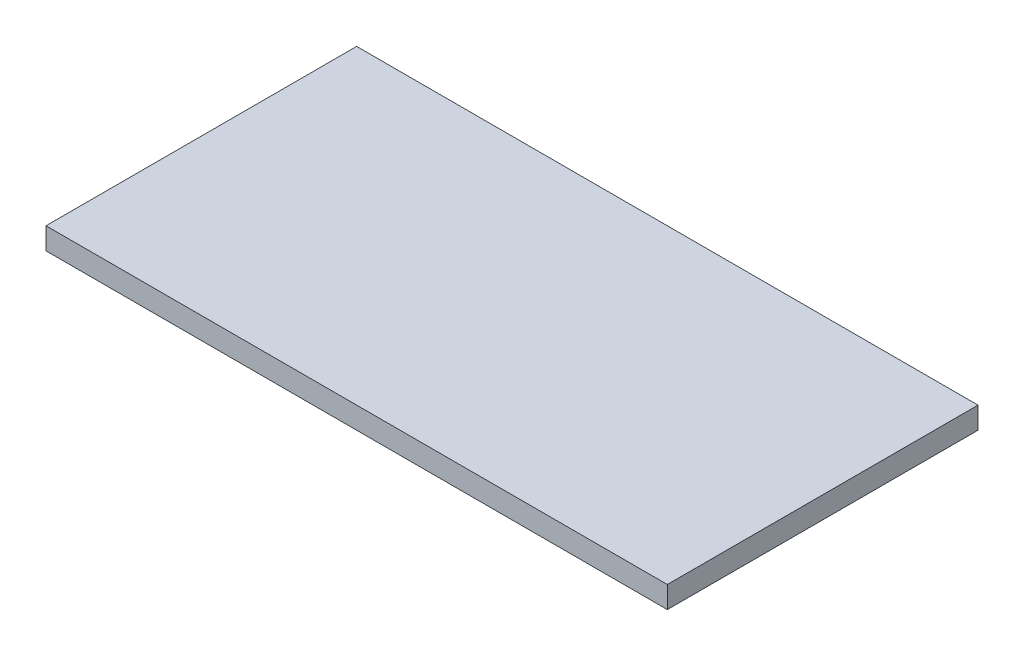
ISO-10303-21;
HEADER;
FILE_DESCRIPTION(('STEP AP214'),'2;1');
FILE_NAME('part.step','',(''),(''),'','','');
FILE_SCHEMA(('AUTOMOTIVE_DESIGN { 1 0 10303 214 1 1 1 1 }'));
ENDSEC;
DATA;
#1=APPLICATION_CONTEXT('core data for automotive mechanical design processes');
#2=APPLICATION_PROTOCOL_DEFINITION('international standard','automotive_design',2000,#1);
#3=PRODUCT_CONTEXT('',#1,'mechanical');
#4=PRODUCT('Part','Part','',(#3));
#5=PRODUCT_RELATED_PRODUCT_CATEGORY('part','',(#4));
#6=PRODUCT_DEFINITION_FORMATION('','',#4);
#7=PRODUCT_DEFINITION_CONTEXT('part definition',#1,'design');
#8=PRODUCT_DEFINITION('design','',#6,#7);
#9=PRODUCT_DEFINITION_SHAPE('','',#8);
#10=(LENGTH_UNIT() NAMED_UNIT(*) SI_UNIT(.MILLI.,.METRE.));
#11=(NAMED_UNIT(*) PLANE_ANGLE_UNIT() SI_UNIT($,.RADIAN.));
#12=(NAMED_UNIT(*) SI_UNIT($,.STERADIAN.) SOLID_ANGLE_UNIT());
#13=UNCERTAINTY_MEASURE_WITH_UNIT(LENGTH_MEASURE(1.E-05),#10,'distance_accuracy_value','');
#14=(GEOMETRIC_REPRESENTATION_CONTEXT(3) GLOBAL_UNCERTAINTY_ASSIGNED_CONTEXT((#13)) GLOBAL_UNIT_ASSIGNED_CONTEXT((#10,
#11,#12)) REPRESENTATION_CONTEXT('',''));
#15=CARTESIAN_POINT('',(0.,0.,0.));
#16=DIRECTION('',(0.,0.,1.));
#17=DIRECTION('',(1.,0.,0.));
#18=AXIS2_PLACEMENT_3D('',#15,#16,#17);
#19=CARTESIAN_POINT('',(10.,0.7,5.));
#20=DIRECTION('',(-1.,0.,0.));
#21=DIRECTION('',(0.,0.,1.));
#22=AXIS2_PLACEMENT_3D('',#19,#20,#21);
#23=PLANE('',#22);
#24=DIRECTION('',(0.,0.,-1.));
#25=VECTOR('',#24,1.);
#26=CARTESIAN_POINT('',(10.,0.,5.));
#27=LINE('',#26,#25);
#28=CARTESIAN_POINT('',(10.,0.,5.));
#29=VERTEX_POINT('',#28);
#30=CARTESIAN_POINT('',(10.,0.,-5.));
#31=VERTEX_POINT('',#30);
#32=EDGE_CURVE('E96',#29,#31,#27,.T.);
#33=ORIENTED_EDGE('',*,*,#32,.T.);
#34=DIRECTION('',(0.,-1.,0.));
#35=VECTOR('',#34,1.);
#36=CARTESIAN_POINT('',(10.,0.7,-5.));
#37=LINE('',#36,#35);
#38=CARTESIAN_POINT('',(10.,0.7,-5.));
#39=VERTEX_POINT('',#38);
#40=EDGE_CURVE('E11',#39,#31,#37,.T.);
#41=ORIENTED_EDGE('',*,*,#40,.F.);
#42=DIRECTION('',(0.,0.,-1.));
#43=VECTOR('',#42,1.);
#44=CARTESIAN_POINT('',(10.,0.7,5.));
#45=LINE('',#44,#43);
#46=CARTESIAN_POINT('',(10.,0.7,5.));
#47=VERTEX_POINT('',#46);
#48=EDGE_CURVE('E84',#47,#39,#45,.T.);
#49=ORIENTED_EDGE('',*,*,#48,.F.);
#50=DIRECTION('',(0.,-1.,0.));
#51=VECTOR('',#50,1.);
#52=CARTESIAN_POINT('',(10.,0.7,5.));
#53=LINE('',#52,#51);
#54=EDGE_CURVE('E92',#47,#29,#53,.T.);
#55=ORIENTED_EDGE('',*,*,#54,.T.);
#56=EDGE_LOOP('',(#33,#41,#49,#55));
#57=FACE_BOUND('',#56,.T.);
#58=ADVANCED_FACE('F33',(#57),#23,.F.);
#59=CARTESIAN_POINT('',(-10.,0.7,-5.));
#60=DIRECTION('',(0.,0.,1.));
#61=DIRECTION('',(1.,0.,0.));
#62=AXIS2_PLACEMENT_3D('',#59,#60,#61);
#63=PLANE('',#62);
#64=DIRECTION('',(-1.,0.,0.));
#65=VECTOR('',#64,1.);
#66=CARTESIAN_POINT('',(-10.,0.,-5.));
#67=LINE('',#66,#65);
#68=CARTESIAN_POINT('',(-10.,0.,-5.));
#69=VERTEX_POINT('',#68);
#70=EDGE_CURVE('E88',#31,#69,#67,.T.);
#71=ORIENTED_EDGE('',*,*,#70,.T.);
#72=DIRECTION('',(0.,-1.,0.));
#73=VECTOR('',#72,1.);
#74=CARTESIAN_POINT('',(-10.,0.7,-5.));
#75=LINE('',#74,#73);
#76=CARTESIAN_POINT('',(-10.,0.7,-5.));
#77=VERTEX_POINT('',#76);
#78=EDGE_CURVE('E41',#77,#69,#75,.T.);
#79=ORIENTED_EDGE('',*,*,#78,.F.);
#80=DIRECTION('',(-1.,0.,0.));
#81=VECTOR('',#80,1.);
#82=CARTESIAN_POINT('',(-10.,0.7,-5.));
#83=LINE('',#82,#81);
#84=EDGE_CURVE('E79',#39,#77,#83,.T.);
#85=ORIENTED_EDGE('',*,*,#84,.F.);
#86=ORIENTED_EDGE('',*,*,#40,.T.);
#87=EDGE_LOOP('',(#71,#79,#85,#86));
#88=FACE_BOUND('',#87,.T.);
#89=ADVANCED_FACE('F87',(#88),#63,.F.);
#90=CARTESIAN_POINT('',(-10.,0.7,5.));
#91=DIRECTION('',(1.,0.,0.));
#92=DIRECTION('',(0.,0.,-1.));
#93=AXIS2_PLACEMENT_3D('',#90,#91,#92);
#94=PLANE('',#93);
#95=DIRECTION('',(0.,0.,1.));
#96=VECTOR('',#95,1.);
#97=CARTESIAN_POINT('',(-10.,0.,5.));
#98=LINE('',#97,#96);
#99=CARTESIAN_POINT('',(-10.,0.,5.));
#100=VERTEX_POINT('',#99);
#101=EDGE_CURVE('E66',#69,#100,#98,.T.);
#102=ORIENTED_EDGE('',*,*,#101,.T.);
#103=DIRECTION('',(0.,-1.,0.));
#104=VECTOR('',#103,1.);
#105=CARTESIAN_POINT('',(-10.,0.7,5.));
#106=LINE('',#105,#104);
#107=CARTESIAN_POINT('',(-10.,0.7,5.));
#108=VERTEX_POINT('',#107);
#109=EDGE_CURVE('E89',#108,#100,#106,.T.);
#110=ORIENTED_EDGE('',*,*,#109,.F.);
#111=DIRECTION('',(0.,0.,1.));
#112=VECTOR('',#111,1.);
#113=CARTESIAN_POINT('',(-10.,0.7,5.));
#114=LINE('',#113,#112);
#115=EDGE_CURVE('E82',#77,#108,#114,.T.);
#116=ORIENTED_EDGE('',*,*,#115,.F.);
#117=ORIENTED_EDGE('',*,*,#78,.T.);
#118=EDGE_LOOP('',(#102,#110,#116,#117));
#119=FACE_BOUND('',#118,.T.);
#120=ADVANCED_FACE('F90',(#119),#94,.F.);
#121=CARTESIAN_POINT('',(-10.,0.7,5.));
#122=DIRECTION('',(0.,0.,-1.));
#123=DIRECTION('',(-1.,0.,0.));
#124=AXIS2_PLACEMENT_3D('',#121,#122,#123);
#125=PLANE('',#124);
#126=DIRECTION('',(1.,0.,0.));
#127=VECTOR('',#126,1.);
#128=CARTESIAN_POINT('',(-10.,0.,5.));
#129=LINE('',#128,#127);
#130=EDGE_CURVE('E72',#100,#29,#129,.T.);
#131=ORIENTED_EDGE('',*,*,#130,.T.);
#132=ORIENTED_EDGE('',*,*,#54,.F.);
#133=DIRECTION('',(1.,0.,0.));
#134=VECTOR('',#133,1.);
#135=CARTESIAN_POINT('',(-10.,0.7,5.));
#136=LINE('',#135,#134);
#137=EDGE_CURVE('E49',#108,#47,#136,.T.);
#138=ORIENTED_EDGE('',*,*,#137,.F.);
#139=ORIENTED_EDGE('',*,*,#109,.T.);
#140=EDGE_LOOP('',(#131,#132,#138,#139));
#141=FACE_BOUND('',#140,.T.);
#142=ADVANCED_FACE('F103',(#141),#125,.F.);
#143=CARTESIAN_POINT('',(0.,0.7,0.));
#144=DIRECTION('',(0.,-1.,0.));
#145=DIRECTION('',(0.,0.,-1.));
#146=AXIS2_PLACEMENT_3D('',#143,#144,#145);
#147=PLANE('',#146);
#148=ORIENTED_EDGE('',*,*,#48,.T.);
#149=ORIENTED_EDGE('',*,*,#84,.T.);
#150=ORIENTED_EDGE('',*,*,#115,.T.);
#151=ORIENTED_EDGE('',*,*,#137,.T.);
#152=EDGE_LOOP('',(#148,#149,#150,#151));
#153=FACE_BOUND('',#152,.T.);
#154=ADVANCED_FACE('F80',(#153),#147,.F.);
#155=CARTESIAN_POINT('',(0.,0.,0.));
#156=DIRECTION('',(0.,-1.,0.));
#157=DIRECTION('',(0.,0.,-1.));
#158=AXIS2_PLACEMENT_3D('',#155,#156,#157);
#159=PLANE('',#158);
#160=ORIENTED_EDGE('',*,*,#32,.F.);
#161=ORIENTED_EDGE('',*,*,#130,.F.);
#162=ORIENTED_EDGE('',*,*,#101,.F.);
#163=ORIENTED_EDGE('',*,*,#70,.F.);
#164=EDGE_LOOP('',(#160,#161,#162,#163));
#165=FACE_BOUND('',#164,.T.);
#166=ADVANCED_FACE('F106',(#165),#159,.T.);
#167=CLOSED_SHELL('',(#58,#89,#120,#142,#154,#166));
#168=MANIFOLD_SOLID_BREP('B2',#167);
#169=ADVANCED_BREP_SHAPE_REPRESENTATION('',(#18,#168),#14);
#170=SHAPE_DEFINITION_REPRESENTATION(#9,#169);
ENDSEC;
END-ISO-10303-21;
